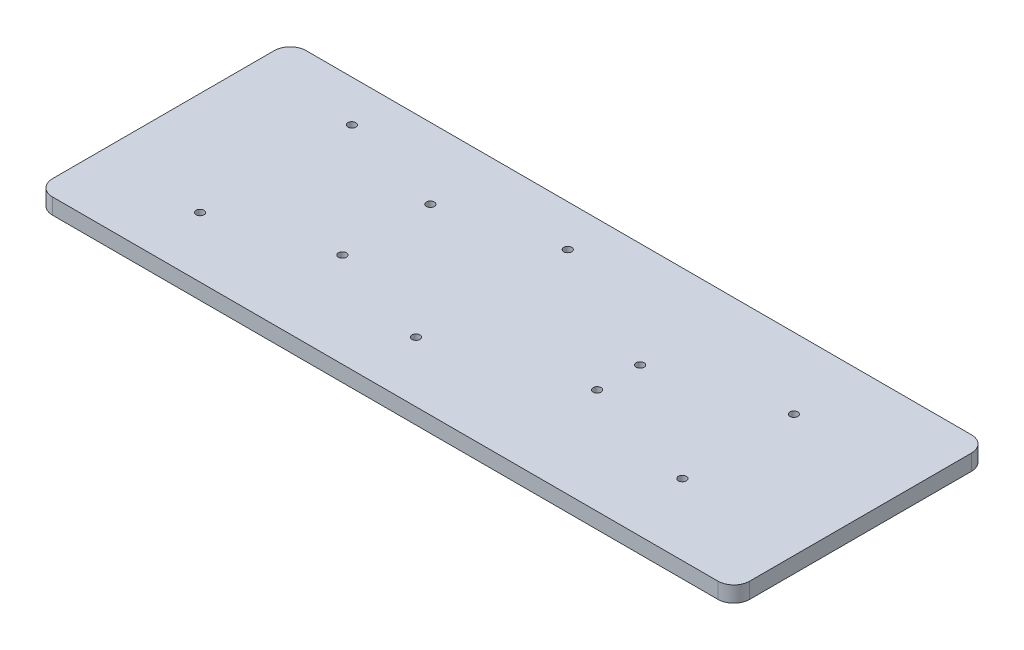
ISO-10303-21;
HEADER;
FILE_DESCRIPTION(('STEP AP214'),'2;1');
FILE_NAME('part.step','',(''),(''),'','','');
FILE_SCHEMA(('AUTOMOTIVE_DESIGN { 1 0 10303 214 1 1 1 1 }'));
ENDSEC;
DATA;
#1=APPLICATION_CONTEXT('core data for automotive mechanical design processes');
#2=APPLICATION_PROTOCOL_DEFINITION('international standard','automotive_design',2000,#1);
#3=PRODUCT_CONTEXT('',#1,'mechanical');
#4=PRODUCT('Part','Part','',(#3));
#5=PRODUCT_RELATED_PRODUCT_CATEGORY('part','',(#4));
#6=PRODUCT_DEFINITION_FORMATION('','',#4);
#7=PRODUCT_DEFINITION_CONTEXT('part definition',#1,'design');
#8=PRODUCT_DEFINITION('design','',#6,#7);
#9=PRODUCT_DEFINITION_SHAPE('','',#8);
#10=(LENGTH_UNIT() NAMED_UNIT(*) SI_UNIT(.MILLI.,.METRE.));
#11=(NAMED_UNIT(*) PLANE_ANGLE_UNIT() SI_UNIT($,.RADIAN.));
#12=(NAMED_UNIT(*) SI_UNIT($,.STERADIAN.) SOLID_ANGLE_UNIT());
#13=UNCERTAINTY_MEASURE_WITH_UNIT(LENGTH_MEASURE(1.E-05),#10,'distance_accuracy_value','');
#14=(GEOMETRIC_REPRESENTATION_CONTEXT(3) GLOBAL_UNCERTAINTY_ASSIGNED_CONTEXT((#13)) GLOBAL_UNIT_ASSIGNED_CONTEXT((#10,
#11,#12)) REPRESENTATION_CONTEXT('',''));
#15=CARTESIAN_POINT('',(0.,0.,0.));
#16=DIRECTION('',(0.,0.,1.));
#17=DIRECTION('',(1.,0.,0.));
#18=AXIS2_PLACEMENT_3D('',#15,#16,#17);
#19=CARTESIAN_POINT('',(911.579762169948,-57.9059737890912,20.8790325673059));
#20=DIRECTION('',(0.,1.,0.));
#21=DIRECTION('',(0.,0.,1.));
#22=AXIS2_PLACEMENT_3D('',#19,#20,#21);
#23=PLANE('',#22);
#24=CARTESIAN_POINT('',(1263.75808829654,-57.9059737890912,105.2220794053));
#25=DIRECTION('',(0.,1.,0.));
#26=DIRECTION('',(0.,0.,1.));
#27=AXIS2_PLACEMENT_3D('',#24,#25,#26);
#28=CIRCLE('',#27,3.17499999999986);
#29=CARTESIAN_POINT('',(1263.75808829654,-57.9059737890912,108.397079405299));
#30=VERTEX_POINT('',#29);
#31=EDGE_CURVE('E497',#30,#30,#28,.T.);
#32=ORIENTED_EDGE('',*,*,#31,.F.);
#33=EDGE_LOOP('',(#32));
#34=FACE_BOUND('',#33,.T.);
#35=CARTESIAN_POINT('',(1263.75808829654,-57.9059737890912,139.735985729313));
#36=DIRECTION('',(0.,1.,0.));
#37=DIRECTION('',(0.,0.,1.));
#38=AXIS2_PLACEMENT_3D('',#35,#36,#37);
#39=CIRCLE('',#38,3.17499999999986);
#40=CARTESIAN_POINT('',(1263.75808829654,-57.9059737890912,142.910985729313));
#41=VERTEX_POINT('',#40);
#42=EDGE_CURVE('E139',#41,#41,#39,.T.);
#43=ORIENTED_EDGE('',*,*,#42,.F.);
#44=EDGE_LOOP('',(#43));
#45=FACE_BOUND('',#44,.T.);
#46=CARTESIAN_POINT('',(1154.58194925451,-57.9059737890912,54.0981721017048));
#47=DIRECTION('',(0.,1.,0.));
#48=DIRECTION('',(0.,0.,1.));
#49=AXIS2_PLACEMENT_3D('',#46,#47,#48);
#50=CIRCLE('',#49,3.175);
#51=CARTESIAN_POINT('',(1154.58194925451,-57.9059737890912,57.2731721017048));
#52=VERTEX_POINT('',#51);
#53=EDGE_CURVE('E43',#52,#52,#50,.F.);
#54=ORIENTED_EDGE('',*,*,#53,.T.);
#55=EDGE_LOOP('',(#54));
#56=FACE_BOUND('',#55,.T.);
#57=CARTESIAN_POINT('',(981.548810971771,-57.9059737890912,54.0981721017048));
#58=DIRECTION('',(0.,1.,0.));
#59=DIRECTION('',(0.,0.,1.));
#60=AXIS2_PLACEMENT_3D('',#57,#58,#59);
#61=CIRCLE('',#60,3.175);
#62=CARTESIAN_POINT('',(981.548810971771,-57.9059737890912,57.2731721017048));
#63=VERTEX_POINT('',#62);
#64=EDGE_CURVE('E217',#63,#63,#61,.F.);
#65=ORIENTED_EDGE('',*,*,#64,.T.);
#66=EDGE_LOOP('',(#65));
#67=FACE_BOUND('',#66,.T.);
#68=CARTESIAN_POINT('',(1068.06538011314,-57.9059737890912,148.226965703462));
#69=DIRECTION('',(0.,1.,0.));
#70=DIRECTION('',(0.,0.,1.));
#71=AXIS2_PLACEMENT_3D('',#68,#69,#70);
#72=CIRCLE('',#71,3.175);
#73=CARTESIAN_POINT('',(1068.06538011314,-57.9059737890912,151.401965703462));
#74=VERTEX_POINT('',#73);
#75=EDGE_CURVE('E210',#74,#74,#72,.F.);
#76=ORIENTED_EDGE('',*,*,#75,.T.);
#77=EDGE_LOOP('',(#76));
#78=FACE_BOUND('',#77,.T.);
#79=CARTESIAN_POINT('',(1154.58194925451,-57.9059737890912,175.771167437158));
#80=DIRECTION('',(0.,1.,0.));
#81=DIRECTION('',(0.,0.,1.));
#82=AXIS2_PLACEMENT_3D('',#79,#80,#81);
#83=CIRCLE('',#82,3.175);
#84=CARTESIAN_POINT('',(1154.58194925451,-57.9059737890912,178.946167437158));
#85=VERTEX_POINT('',#84);
#86=EDGE_CURVE('E207',#85,#85,#83,.F.);
#87=ORIENTED_EDGE('',*,*,#86,.T.);
#88=EDGE_LOOP('',(#87));
#89=FACE_BOUND('',#88,.T.);
#90=CARTESIAN_POINT('',(981.548810971771,-57.9059737890912,175.771167437158));
#91=DIRECTION('',(0.,1.,0.));
#92=DIRECTION('',(0.,0.,1.));
#93=AXIS2_PLACEMENT_3D('',#90,#91,#92);
#94=CIRCLE('',#93,3.175);
#95=CARTESIAN_POINT('',(981.548810971771,-57.9059737890912,178.946167437158));
#96=VERTEX_POINT('',#95);
#97=EDGE_CURVE('E214',#96,#96,#94,.F.);
#98=ORIENTED_EDGE('',*,*,#97,.T.);
#99=EDGE_LOOP('',(#98));
#100=FACE_BOUND('',#99,.T.);
#101=CARTESIAN_POINT('',(1068.06538011314,-57.9059737890912,77.7278467876854));
#102=DIRECTION('',(0.,1.,0.));
#103=DIRECTION('',(0.,0.,1.));
#104=AXIS2_PLACEMENT_3D('',#101,#102,#103);
#105=CIRCLE('',#104,3.175);
#106=CARTESIAN_POINT('',(1068.06538011314,-57.9059737890912,80.9028467876854));
#107=VERTEX_POINT('',#106);
#108=EDGE_CURVE('E137',#107,#107,#105,.F.);
#109=ORIENTED_EDGE('',*,*,#108,.T.);
#110=EDGE_LOOP('',(#109));
#111=FACE_BOUND('',#110,.T.);
#112=DIRECTION('',(-1.,0.,0.));
#113=VECTOR('',#112,1.);
#114=CARTESIAN_POINT('',(898.879762169948,-57.9059737890912,20.8790325673059));
#115=LINE('',#114,#113);
#116=CARTESIAN_POINT('',(1444.97976216995,-57.9059737890912,20.8790325673059));
#117=VERTEX_POINT('',#116);
#118=CARTESIAN_POINT('',(911.579762169948,-57.9059737890912,20.8790325673059));
#119=VERTEX_POINT('',#118);
#120=EDGE_CURVE('E171',#117,#119,#115,.T.);
#121=ORIENTED_EDGE('',*,*,#120,.T.);
#122=CARTESIAN_POINT('',(911.579762169948,-57.9059737890912,33.5790325673059));
#123=DIRECTION('',(0.,-1.,0.));
#124=DIRECTION('',(0.,0.,-1.));
#125=AXIS2_PLACEMENT_3D('',#122,#123,#124);
#126=CIRCLE('',#125,12.7);
#127=CARTESIAN_POINT('',(898.879762169948,-57.9059737890912,33.5790325673059));
#128=VERTEX_POINT('',#127);
#129=EDGE_CURVE('E64',#119,#128,#126,.F.);
#130=ORIENTED_EDGE('',*,*,#129,.T.);
#131=DIRECTION('',(0.,0.,1.));
#132=VECTOR('',#131,1.);
#133=CARTESIAN_POINT('',(898.879762169948,-57.9059737890912,224.079032567306));
#134=LINE('',#133,#132);
#135=CARTESIAN_POINT('',(898.879762169948,-57.9059737890912,211.379032567306));
#136=VERTEX_POINT('',#135);
#137=EDGE_CURVE('E168',#128,#136,#134,.T.);
#138=ORIENTED_EDGE('',*,*,#137,.T.);
#139=CARTESIAN_POINT('',(911.579762169948,-57.9059737890912,211.379032567306));
#140=DIRECTION('',(0.,-1.,0.));
#141=DIRECTION('',(0.,0.,-1.));
#142=AXIS2_PLACEMENT_3D('',#139,#140,#141);
#143=CIRCLE('',#142,12.7);
#144=CARTESIAN_POINT('',(911.579762169948,-57.9059737890912,224.079032567306));
#145=VERTEX_POINT('',#144);
#146=EDGE_CURVE('E156',#136,#145,#143,.F.);
#147=ORIENTED_EDGE('',*,*,#146,.T.);
#148=DIRECTION('',(1.,0.,0.));
#149=VECTOR('',#148,1.);
#150=CARTESIAN_POINT('',(1457.67976216995,-57.9059737890912,224.079032567306));
#151=LINE('',#150,#149);
#152=CARTESIAN_POINT('',(1444.97976216995,-57.9059737890912,224.079032567306));
#153=VERTEX_POINT('',#152);
#154=EDGE_CURVE('E173',#145,#153,#151,.T.);
#155=ORIENTED_EDGE('',*,*,#154,.T.);
#156=CARTESIAN_POINT('',(1444.97976216995,-57.9059737890912,211.379032567306));
#157=DIRECTION('',(0.,-1.,0.));
#158=DIRECTION('',(0.,0.,-1.));
#159=AXIS2_PLACEMENT_3D('',#156,#157,#158);
#160=CIRCLE('',#159,12.7);
#161=CARTESIAN_POINT('',(1457.67976216995,-57.9059737890912,211.379032567306));
#162=VERTEX_POINT('',#161);
#163=EDGE_CURVE('E159',#153,#162,#160,.F.);
#164=ORIENTED_EDGE('',*,*,#163,.T.);
#165=DIRECTION('',(0.,0.,-1.));
#166=VECTOR('',#165,1.);
#167=CARTESIAN_POINT('',(1457.67976216995,-57.9059737890912,175.374532567307));
#168=LINE('',#167,#166);
#169=CARTESIAN_POINT('',(1457.67976216995,-57.9059737890912,33.5790325673059));
#170=VERTEX_POINT('',#169);
#171=EDGE_CURVE('E165',#162,#170,#168,.T.);
#172=ORIENTED_EDGE('',*,*,#171,.T.);
#173=CARTESIAN_POINT('',(1444.97976216995,-57.9059737890912,33.5790325673059));
#174=DIRECTION('',(0.,-1.,0.));
#175=DIRECTION('',(0.,0.,-1.));
#176=AXIS2_PLACEMENT_3D('',#173,#174,#175);
#177=CIRCLE('',#176,12.7);
#178=EDGE_CURVE('E56',#170,#117,#177,.F.);
#179=ORIENTED_EDGE('',*,*,#178,.T.);
#180=EDGE_LOOP('',(#121,#130,#138,#147,#155,#164,#172,#179));
#181=FACE_BOUND('',#180,.T.);
#182=CARTESIAN_POINT('',(1359.51608829654,-57.9059737890912,167.167985729313));
#183=DIRECTION('',(0.,1.,0.));
#184=DIRECTION('',(0.,0.,1.));
#185=AXIS2_PLACEMENT_3D('',#182,#183,#184);
#186=CIRCLE('',#185,3.17499999999997);
#187=CARTESIAN_POINT('',(1359.51608829654,-57.9059737890912,170.342985729313));
#188=VERTEX_POINT('',#187);
#189=EDGE_CURVE('E201',#188,#188,#186,.T.);
#190=ORIENTED_EDGE('',*,*,#189,.F.);
#191=EDGE_LOOP('',(#190));
#192=FACE_BOUND('',#191,.T.);
#193=CARTESIAN_POINT('',(1359.51608829654,-57.9059737890912,77.7900794052995));
#194=DIRECTION('',(0.,1.,0.));
#195=DIRECTION('',(0.,0.,1.));
#196=AXIS2_PLACEMENT_3D('',#193,#194,#195);
#197=CIRCLE('',#196,3.17499999999997);
#198=CARTESIAN_POINT('',(1359.51608829654,-57.9059737890912,80.9650794052995));
#199=VERTEX_POINT('',#198);
#200=EDGE_CURVE('E48',#199,#199,#197,.T.);
#201=ORIENTED_EDGE('',*,*,#200,.F.);
#202=EDGE_LOOP('',(#201));
#203=FACE_BOUND('',#202,.T.);
#204=ADVANCED_FACE('F39',(#34,#45,#56,#67,#78,#89,#100,#111,#181,#192,#203),#23,.T.);
#205=CARTESIAN_POINT('',(898.879762169948,-70.6059737890912,224.079032567306));
#206=DIRECTION('',(-1.,0.,0.));
#207=DIRECTION('',(0.,0.,1.));
#208=AXIS2_PLACEMENT_3D('',#205,#206,#207);
#209=PLANE('',#208);
#210=ORIENTED_EDGE('',*,*,#137,.F.);
#211=DIRECTION('',(0.,1.,0.));
#212=VECTOR('',#211,1.);
#213=CARTESIAN_POINT('',(898.879762169948,-70.6059737890912,33.5790325673059));
#214=LINE('',#213,#212);
#215=CARTESIAN_POINT('',(898.879762169948,-70.6059737890912,33.5790325673059));
#216=VERTEX_POINT('',#215);
#217=EDGE_CURVE('E150',#128,#216,#214,.F.);
#218=ORIENTED_EDGE('',*,*,#217,.T.);
#219=DIRECTION('',(0.,0.,1.));
#220=VECTOR('',#219,1.);
#221=CARTESIAN_POINT('',(898.879762169948,-70.6059737890912,224.079032567306));
#222=LINE('',#221,#220);
#223=CARTESIAN_POINT('',(898.879762169948,-70.6059737890912,211.379032567306));
#224=VERTEX_POINT('',#223);
#225=EDGE_CURVE('E167',#216,#224,#222,.T.);
#226=ORIENTED_EDGE('',*,*,#225,.T.);
#227=DIRECTION('',(0.,1.,0.));
#228=VECTOR('',#227,1.);
#229=CARTESIAN_POINT('',(898.879762169948,-70.6059737890912,211.379032567306));
#230=LINE('',#229,#228);
#231=EDGE_CURVE('E152',#224,#136,#230,.T.);
#232=ORIENTED_EDGE('',*,*,#231,.T.);
#233=EDGE_LOOP('',(#210,#218,#226,#232));
#234=FACE_BOUND('',#233,.T.);
#235=ADVANCED_FACE('F238',(#234),#209,.T.);
#236=CARTESIAN_POINT('',(898.879762169948,-70.6059737890912,20.8790325673059));
#237=DIRECTION('',(0.,0.,-1.));
#238=DIRECTION('',(-1.,0.,0.));
#239=AXIS2_PLACEMENT_3D('',#236,#237,#238);
#240=PLANE('',#239);
#241=DIRECTION('',(-1.,0.,0.));
#242=VECTOR('',#241,1.);
#243=CARTESIAN_POINT('',(898.879762169948,-70.6059737890912,20.8790325673059));
#244=LINE('',#243,#242);
#245=CARTESIAN_POINT('',(1444.97976216995,-70.6059737890912,20.8790325673059));
#246=VERTEX_POINT('',#245);
#247=CARTESIAN_POINT('',(911.579762169948,-70.6059737890912,20.8790325673059));
#248=VERTEX_POINT('',#247);
#249=EDGE_CURVE('E116',#246,#248,#244,.T.);
#250=ORIENTED_EDGE('',*,*,#249,.T.);
#251=DIRECTION('',(0.,1.,0.));
#252=VECTOR('',#251,1.);
#253=CARTESIAN_POINT('',(911.579762169948,-70.6059737890912,20.8790325673059));
#254=LINE('',#253,#252);
#255=EDGE_CURVE('E161',#248,#119,#254,.T.);
#256=ORIENTED_EDGE('',*,*,#255,.T.);
#257=ORIENTED_EDGE('',*,*,#120,.F.);
#258=DIRECTION('',(0.,1.,0.));
#259=VECTOR('',#258,1.);
#260=CARTESIAN_POINT('',(1444.97976216995,-70.6059737890912,20.8790325673059));
#261=LINE('',#260,#259);
#262=EDGE_CURVE('E163',#117,#246,#261,.F.);
#263=ORIENTED_EDGE('',*,*,#262,.T.);
#264=EDGE_LOOP('',(#250,#256,#257,#263));
#265=FACE_BOUND('',#264,.T.);
#266=ADVANCED_FACE('F240',(#265),#240,.T.);
#267=CARTESIAN_POINT('',(1457.67976216995,-70.6059737890912,224.079032567306));
#268=DIRECTION('',(0.,0.,1.));
#269=DIRECTION('',(1.,0.,0.));
#270=AXIS2_PLACEMENT_3D('',#267,#268,#269);
#271=PLANE('',#270);
#272=ORIENTED_EDGE('',*,*,#154,.F.);
#273=DIRECTION('',(0.,1.,0.));
#274=VECTOR('',#273,1.);
#275=CARTESIAN_POINT('',(911.579762169948,-70.6059737890912,224.079032567306));
#276=LINE('',#275,#274);
#277=CARTESIAN_POINT('',(911.579762169948,-70.6059737890912,224.079032567306));
#278=VERTEX_POINT('',#277);
#279=EDGE_CURVE('E134',#145,#278,#276,.F.);
#280=ORIENTED_EDGE('',*,*,#279,.T.);
#281=DIRECTION('',(1.,0.,0.));
#282=VECTOR('',#281,1.);
#283=CARTESIAN_POINT('',(1457.67976216995,-70.6059737890912,224.079032567306));
#284=LINE('',#283,#282);
#285=CARTESIAN_POINT('',(1444.97976216995,-70.6059737890912,224.079032567306));
#286=VERTEX_POINT('',#285);
#287=EDGE_CURVE('E130',#278,#286,#284,.T.);
#288=ORIENTED_EDGE('',*,*,#287,.T.);
#289=DIRECTION('',(0.,1.,0.));
#290=VECTOR('',#289,1.);
#291=CARTESIAN_POINT('',(1444.97976216995,-70.6059737890912,224.079032567306));
#292=LINE('',#291,#290);
#293=EDGE_CURVE('E143',#286,#153,#292,.T.);
#294=ORIENTED_EDGE('',*,*,#293,.T.);
#295=EDGE_LOOP('',(#272,#280,#288,#294));
#296=FACE_BOUND('',#295,.T.);
#297=ADVANCED_FACE('F246',(#296),#271,.T.);
#298=CARTESIAN_POINT('',(1457.67976216995,-213.112612249011,31.1034974157241));
#299=DIRECTION('',(1.,0.,0.));
#300=DIRECTION('',(0.,0.,-1.));
#301=AXIS2_PLACEMENT_3D('',#298,#299,#300);
#302=PLANE('',#301);
#303=DIRECTION('',(0.,0.,-1.));
#304=VECTOR('',#303,1.);
#305=CARTESIAN_POINT('',(1457.67976216995,-70.6059737890912,20.8790325673059));
#306=LINE('',#305,#304);
#307=CARTESIAN_POINT('',(1457.67976216995,-70.6059737890912,211.379032567306));
#308=VERTEX_POINT('',#307);
#309=CARTESIAN_POINT('',(1457.67976216995,-70.6059737890912,33.5790325673059));
#310=VERTEX_POINT('',#309);
#311=EDGE_CURVE('E113',#308,#310,#306,.T.);
#312=ORIENTED_EDGE('',*,*,#311,.T.);
#313=DIRECTION('',(0.,1.,0.));
#314=VECTOR('',#313,1.);
#315=CARTESIAN_POINT('',(1457.67976216995,-213.112612249011,33.5790325673059));
#316=LINE('',#315,#314);
#317=EDGE_CURVE('E127',#310,#170,#316,.T.);
#318=ORIENTED_EDGE('',*,*,#317,.T.);
#319=ORIENTED_EDGE('',*,*,#171,.F.);
#320=DIRECTION('',(0.,1.,0.));
#321=VECTOR('',#320,1.);
#322=CARTESIAN_POINT('',(1457.67976216995,-213.112612249011,211.379032567306));
#323=LINE('',#322,#321);
#324=EDGE_CURVE('E129',#162,#308,#323,.F.);
#325=ORIENTED_EDGE('',*,*,#324,.T.);
#326=EDGE_LOOP('',(#312,#318,#319,#325));
#327=FACE_BOUND('',#326,.T.);
#328=ADVANCED_FACE('F125',(#327),#302,.T.);
#329=CARTESIAN_POINT('',(1087.08581097177,-70.6059737890912,183.503497415724));
#330=DIRECTION('',(0.,-1.,0.));
#331=DIRECTION('',(0.,0.,-1.));
#332=AXIS2_PLACEMENT_3D('',#329,#330,#331);
#333=PLANE('',#332);
#334=CARTESIAN_POINT('',(1263.75808829654,-70.6059737890912,105.2220794053));
#335=DIRECTION('',(0.,-1.,0.));
#336=DIRECTION('',(0.,0.,-1.));
#337=AXIS2_PLACEMENT_3D('',#334,#335,#336);
#338=CIRCLE('',#337,3.17499999999986);
#339=CARTESIAN_POINT('',(1263.75808829654,-70.6059737890912,102.0470794053));
#340=VERTEX_POINT('',#339);
#341=EDGE_CURVE('E211',#340,#340,#338,.F.);
#342=ORIENTED_EDGE('',*,*,#341,.T.);
#343=EDGE_LOOP('',(#342));
#344=FACE_BOUND('',#343,.T.);
#345=CARTESIAN_POINT('',(1263.75808829654,-70.6059737890912,139.735985729313));
#346=DIRECTION('',(0.,-1.,0.));
#347=DIRECTION('',(0.,0.,-1.));
#348=AXIS2_PLACEMENT_3D('',#345,#346,#347);
#349=CIRCLE('',#348,3.17499999999986);
#350=CARTESIAN_POINT('',(1263.75808829654,-70.6059737890912,136.560985729313));
#351=VERTEX_POINT('',#350);
#352=EDGE_CURVE('E502',#351,#351,#349,.F.);
#353=ORIENTED_EDGE('',*,*,#352,.T.);
#354=EDGE_LOOP('',(#353));
#355=FACE_BOUND('',#354,.T.);
#356=CARTESIAN_POINT('',(1359.51608829654,-70.6059737890912,167.167985729313));
#357=DIRECTION('',(0.,-1.,0.));
#358=DIRECTION('',(0.,0.,-1.));
#359=AXIS2_PLACEMENT_3D('',#356,#357,#358);
#360=CIRCLE('',#359,3.17499999999997);
#361=CARTESIAN_POINT('',(1359.51608829654,-70.6059737890912,163.992985729313));
#362=VERTEX_POINT('',#361);
#363=EDGE_CURVE('E188',#362,#362,#360,.F.);
#364=ORIENTED_EDGE('',*,*,#363,.T.);
#365=EDGE_LOOP('',(#364));
#366=FACE_BOUND('',#365,.T.);
#367=CARTESIAN_POINT('',(1359.51608829654,-70.6059737890912,77.7900794052995));
#368=DIRECTION('',(0.,-1.,0.));
#369=DIRECTION('',(0.,0.,-1.));
#370=AXIS2_PLACEMENT_3D('',#367,#368,#369);
#371=CIRCLE('',#370,3.17499999999997);
#372=CARTESIAN_POINT('',(1359.51608829654,-70.6059737890912,74.6150794052995));
#373=VERTEX_POINT('',#372);
#374=EDGE_CURVE('E11',#373,#373,#371,.F.);
#375=ORIENTED_EDGE('',*,*,#374,.T.);
#376=EDGE_LOOP('',(#375));
#377=FACE_BOUND('',#376,.T.);
#378=CARTESIAN_POINT('',(981.548810971771,-70.6059737890912,54.0981721017048));
#379=DIRECTION('',(0.,-1.,0.));
#380=DIRECTION('',(0.,0.,-1.));
#381=AXIS2_PLACEMENT_3D('',#378,#379,#380);
#382=CIRCLE('',#381,3.175);
#383=CARTESIAN_POINT('',(981.548810971771,-70.6059737890912,50.9231721017048));
#384=VERTEX_POINT('',#383);
#385=EDGE_CURVE('E185',#384,#384,#382,.F.);
#386=ORIENTED_EDGE('',*,*,#385,.T.);
#387=EDGE_LOOP('',(#386));
#388=FACE_BOUND('',#387,.T.);
#389=CARTESIAN_POINT('',(1068.06538011314,-70.6059737890912,77.7278467876854));
#390=DIRECTION('',(0.,-1.,0.));
#391=DIRECTION('',(0.,0.,-1.));
#392=AXIS2_PLACEMENT_3D('',#389,#390,#391);
#393=CIRCLE('',#392,3.175);
#394=CARTESIAN_POINT('',(1068.06538011314,-70.6059737890912,74.5528467876854));
#395=VERTEX_POINT('',#394);
#396=EDGE_CURVE('E189',#395,#395,#393,.F.);
#397=ORIENTED_EDGE('',*,*,#396,.T.);
#398=EDGE_LOOP('',(#397));
#399=FACE_BOUND('',#398,.T.);
#400=CARTESIAN_POINT('',(1154.58194925451,-70.6059737890912,54.0981721017048));
#401=DIRECTION('',(0.,-1.,0.));
#402=DIRECTION('',(0.,0.,-1.));
#403=AXIS2_PLACEMENT_3D('',#400,#401,#402);
#404=CIRCLE('',#403,3.175);
#405=CARTESIAN_POINT('',(1154.58194925451,-70.6059737890912,50.9231721017048));
#406=VERTEX_POINT('',#405);
#407=EDGE_CURVE('E192',#406,#406,#404,.F.);
#408=ORIENTED_EDGE('',*,*,#407,.T.);
#409=EDGE_LOOP('',(#408));
#410=FACE_BOUND('',#409,.T.);
#411=CARTESIAN_POINT('',(1154.58194925451,-70.6059737890912,175.771167437158));
#412=DIRECTION('',(0.,-1.,0.));
#413=DIRECTION('',(0.,0.,-1.));
#414=AXIS2_PLACEMENT_3D('',#411,#412,#413);
#415=CIRCLE('',#414,3.175);
#416=CARTESIAN_POINT('',(1154.58194925451,-70.6059737890912,172.596167437158));
#417=VERTEX_POINT('',#416);
#418=EDGE_CURVE('E195',#417,#417,#415,.F.);
#419=ORIENTED_EDGE('',*,*,#418,.T.);
#420=EDGE_LOOP('',(#419));
#421=FACE_BOUND('',#420,.T.);
#422=CARTESIAN_POINT('',(1068.06538011314,-70.6059737890912,148.226965703462));
#423=DIRECTION('',(0.,-1.,0.));
#424=DIRECTION('',(0.,0.,-1.));
#425=AXIS2_PLACEMENT_3D('',#422,#423,#424);
#426=CIRCLE('',#425,3.175);
#427=CARTESIAN_POINT('',(1068.06538011314,-70.6059737890912,145.051965703462));
#428=VERTEX_POINT('',#427);
#429=EDGE_CURVE('E184',#428,#428,#426,.F.);
#430=ORIENTED_EDGE('',*,*,#429,.T.);
#431=EDGE_LOOP('',(#430));
#432=FACE_BOUND('',#431,.T.);
#433=CARTESIAN_POINT('',(981.548810971771,-70.6059737890912,175.771167437158));
#434=DIRECTION('',(0.,-1.,0.));
#435=DIRECTION('',(0.,0.,-1.));
#436=AXIS2_PLACEMENT_3D('',#433,#434,#435);
#437=CIRCLE('',#436,3.175);
#438=CARTESIAN_POINT('',(981.548810971771,-70.6059737890912,172.596167437158));
#439=VERTEX_POINT('',#438);
#440=EDGE_CURVE('E176',#439,#439,#437,.F.);
#441=ORIENTED_EDGE('',*,*,#440,.T.);
#442=EDGE_LOOP('',(#441));
#443=FACE_BOUND('',#442,.T.);
#444=ORIENTED_EDGE('',*,*,#225,.F.);
#445=CARTESIAN_POINT('',(911.579762169948,-70.6059737890912,33.5790325673059));
#446=DIRECTION('',(0.,-1.,0.));
#447=DIRECTION('',(0.,0.,-1.));
#448=AXIS2_PLACEMENT_3D('',#445,#446,#447);
#449=CIRCLE('',#448,12.7);
#450=EDGE_CURVE('E146',#216,#248,#449,.T.);
#451=ORIENTED_EDGE('',*,*,#450,.T.);
#452=ORIENTED_EDGE('',*,*,#249,.F.);
#453=CARTESIAN_POINT('',(1444.97976216995,-70.6059737890912,33.5790325673059));
#454=DIRECTION('',(0.,-1.,0.));
#455=DIRECTION('',(0.,0.,-1.));
#456=AXIS2_PLACEMENT_3D('',#453,#454,#455);
#457=CIRCLE('',#456,12.7);
#458=EDGE_CURVE('E109',#246,#310,#457,.T.);
#459=ORIENTED_EDGE('',*,*,#458,.T.);
#460=ORIENTED_EDGE('',*,*,#311,.F.);
#461=CARTESIAN_POINT('',(1444.97976216995,-70.6059737890912,211.379032567306));
#462=DIRECTION('',(0.,-1.,0.));
#463=DIRECTION('',(0.,0.,-1.));
#464=AXIS2_PLACEMENT_3D('',#461,#462,#463);
#465=CIRCLE('',#464,12.7);
#466=EDGE_CURVE('E120',#308,#286,#465,.T.);
#467=ORIENTED_EDGE('',*,*,#466,.T.);
#468=ORIENTED_EDGE('',*,*,#287,.F.);
#469=CARTESIAN_POINT('',(911.579762169948,-70.6059737890912,211.379032567306));
#470=DIRECTION('',(0.,-1.,0.));
#471=DIRECTION('',(0.,0.,-1.));
#472=AXIS2_PLACEMENT_3D('',#469,#470,#471);
#473=CIRCLE('',#472,12.7);
#474=EDGE_CURVE('E121',#278,#224,#473,.T.);
#475=ORIENTED_EDGE('',*,*,#474,.T.);
#476=EDGE_LOOP('',(#444,#451,#452,#459,#460,#467,#468,#475));
#477=FACE_BOUND('',#476,.T.);
#478=ADVANCED_FACE('F112',(#344,#355,#366,#377,#388,#399,#410,#421,#432,#443,#477),#333,.T.);
#479=CARTESIAN_POINT('',(1359.51608829654,-79.5862299101603,167.167985729313));
#480=DIRECTION('',(0.,1.,0.));
#481=DIRECTION('',(0.,0.,1.));
#482=AXIS2_PLACEMENT_3D('',#479,#480,#481);
#483=CYLINDRICAL_SURFACE('',#482,3.17499999999997);
#484=ORIENTED_EDGE('',*,*,#189,.T.);
#485=EDGE_LOOP('',(#484));
#486=FACE_BOUND('',#485,.T.);
#487=ORIENTED_EDGE('',*,*,#363,.F.);
#488=EDGE_LOOP('',(#487));
#489=FACE_BOUND('',#488,.T.);
#490=ADVANCED_FACE('F257',(#486,#489),#483,.F.);
#491=CARTESIAN_POINT('',(1359.51608829654,-79.5862299101603,77.7900794052995));
#492=DIRECTION('',(0.,1.,0.));
#493=DIRECTION('',(0.,0.,1.));
#494=AXIS2_PLACEMENT_3D('',#491,#492,#493);
#495=CYLINDRICAL_SURFACE('',#494,3.17499999999997);
#496=ORIENTED_EDGE('',*,*,#200,.T.);
#497=EDGE_LOOP('',(#496));
#498=FACE_BOUND('',#497,.T.);
#499=ORIENTED_EDGE('',*,*,#374,.F.);
#500=EDGE_LOOP('',(#499));
#501=FACE_BOUND('',#500,.T.);
#502=ADVANCED_FACE('F259',(#498,#501),#495,.F.);
#503=CARTESIAN_POINT('',(1444.97976216995,-70.6059737890912,211.379032567306));
#504=DIRECTION('',(0.,1.,0.));
#505=DIRECTION('',(0.,0.,1.));
#506=AXIS2_PLACEMENT_3D('',#503,#504,#505);
#507=CYLINDRICAL_SURFACE('',#506,12.7);
#508=ORIENTED_EDGE('',*,*,#466,.F.);
#509=ORIENTED_EDGE('',*,*,#324,.F.);
#510=ORIENTED_EDGE('',*,*,#163,.F.);
#511=ORIENTED_EDGE('',*,*,#293,.F.);
#512=EDGE_LOOP('',(#508,#509,#510,#511));
#513=FACE_BOUND('',#512,.T.);
#514=ADVANCED_FACE('F262',(#513),#507,.T.);
#515=CARTESIAN_POINT('',(1444.97976216995,-213.112612249011,33.5790325673059));
#516=DIRECTION('',(0.,1.,0.));
#517=DIRECTION('',(0.,0.,1.));
#518=AXIS2_PLACEMENT_3D('',#515,#516,#517);
#519=CYLINDRICAL_SURFACE('',#518,12.7);
#520=ORIENTED_EDGE('',*,*,#458,.F.);
#521=ORIENTED_EDGE('',*,*,#262,.F.);
#522=ORIENTED_EDGE('',*,*,#178,.F.);
#523=ORIENTED_EDGE('',*,*,#317,.F.);
#524=EDGE_LOOP('',(#520,#521,#522,#523));
#525=FACE_BOUND('',#524,.T.);
#526=ADVANCED_FACE('F132',(#525),#519,.T.);
#527=CARTESIAN_POINT('',(911.579762169948,-70.6059737890912,211.379032567306));
#528=DIRECTION('',(0.,1.,0.));
#529=DIRECTION('',(0.,0.,1.));
#530=AXIS2_PLACEMENT_3D('',#527,#528,#529);
#531=CYLINDRICAL_SURFACE('',#530,12.7);
#532=ORIENTED_EDGE('',*,*,#474,.F.);
#533=ORIENTED_EDGE('',*,*,#279,.F.);
#534=ORIENTED_EDGE('',*,*,#146,.F.);
#535=ORIENTED_EDGE('',*,*,#231,.F.);
#536=EDGE_LOOP('',(#532,#533,#534,#535));
#537=FACE_BOUND('',#536,.T.);
#538=ADVANCED_FACE('F348',(#537),#531,.T.);
#539=CARTESIAN_POINT('',(911.579762169948,-70.6059737890912,33.5790325673059));
#540=DIRECTION('',(0.,1.,0.));
#541=DIRECTION('',(0.,0.,1.));
#542=AXIS2_PLACEMENT_3D('',#539,#540,#541);
#543=CYLINDRICAL_SURFACE('',#542,12.7);
#544=ORIENTED_EDGE('',*,*,#450,.F.);
#545=ORIENTED_EDGE('',*,*,#217,.F.);
#546=ORIENTED_EDGE('',*,*,#129,.F.);
#547=ORIENTED_EDGE('',*,*,#255,.F.);
#548=EDGE_LOOP('',(#544,#545,#546,#547));
#549=FACE_BOUND('',#548,.T.);
#550=ADVANCED_FACE('F273',(#549),#543,.T.);
#551=CARTESIAN_POINT('',(1154.58194925451,-79.5862299101603,175.771167437158));
#552=DIRECTION('',(0.,1.,0.));
#553=DIRECTION('',(0.,0.,1.));
#554=AXIS2_PLACEMENT_3D('',#551,#552,#553);
#555=CYLINDRICAL_SURFACE('',#554,3.175);
#556=ORIENTED_EDGE('',*,*,#418,.F.);
#557=EDGE_LOOP('',(#556));
#558=FACE_BOUND('',#557,.T.);
#559=ORIENTED_EDGE('',*,*,#86,.F.);
#560=EDGE_LOOP('',(#559));
#561=FACE_BOUND('',#560,.T.);
#562=ADVANCED_FACE('F271',(#558,#561),#555,.F.);
#563=CARTESIAN_POINT('',(1068.06538011314,-79.5862299101603,148.226965703462));
#564=DIRECTION('',(0.,1.,0.));
#565=DIRECTION('',(0.,0.,1.));
#566=AXIS2_PLACEMENT_3D('',#563,#564,#565);
#567=CYLINDRICAL_SURFACE('',#566,3.175);
#568=ORIENTED_EDGE('',*,*,#429,.F.);
#569=EDGE_LOOP('',(#568));
#570=FACE_BOUND('',#569,.T.);
#571=ORIENTED_EDGE('',*,*,#75,.F.);
#572=EDGE_LOOP('',(#571));
#573=FACE_BOUND('',#572,.T.);
#574=ADVANCED_FACE('F269',(#570,#573),#567,.F.);
#575=CARTESIAN_POINT('',(981.548810971771,-79.5862299101603,175.771167437158));
#576=DIRECTION('',(0.,1.,0.));
#577=DIRECTION('',(0.,0.,1.));
#578=AXIS2_PLACEMENT_3D('',#575,#576,#577);
#579=CYLINDRICAL_SURFACE('',#578,3.175);
#580=ORIENTED_EDGE('',*,*,#440,.F.);
#581=EDGE_LOOP('',(#580));
#582=FACE_BOUND('',#581,.T.);
#583=ORIENTED_EDGE('',*,*,#97,.F.);
#584=EDGE_LOOP('',(#583));
#585=FACE_BOUND('',#584,.T.);
#586=ADVANCED_FACE('F234',(#582,#585),#579,.F.);
#587=CARTESIAN_POINT('',(981.548810971771,-79.5862299101603,54.0981721017048));
#588=DIRECTION('',(0.,1.,0.));
#589=DIRECTION('',(0.,0.,1.));
#590=AXIS2_PLACEMENT_3D('',#587,#588,#589);
#591=CYLINDRICAL_SURFACE('',#590,3.175);
#592=ORIENTED_EDGE('',*,*,#385,.F.);
#593=EDGE_LOOP('',(#592));
#594=FACE_BOUND('',#593,.T.);
#595=ORIENTED_EDGE('',*,*,#64,.F.);
#596=EDGE_LOOP('',(#595));
#597=FACE_BOUND('',#596,.T.);
#598=ADVANCED_FACE('F225',(#594,#597),#591,.F.);
#599=CARTESIAN_POINT('',(1068.06538011314,-79.5862299101603,77.7278467876854));
#600=DIRECTION('',(0.,1.,0.));
#601=DIRECTION('',(0.,0.,1.));
#602=AXIS2_PLACEMENT_3D('',#599,#600,#601);
#603=CYLINDRICAL_SURFACE('',#602,3.175);
#604=ORIENTED_EDGE('',*,*,#396,.F.);
#605=EDGE_LOOP('',(#604));
#606=FACE_BOUND('',#605,.T.);
#607=ORIENTED_EDGE('',*,*,#108,.F.);
#608=EDGE_LOOP('',(#607));
#609=FACE_BOUND('',#608,.T.);
#610=ADVANCED_FACE('F223',(#606,#609),#603,.F.);
#611=CARTESIAN_POINT('',(1154.58194925451,-79.5862299101603,54.0981721017048));
#612=DIRECTION('',(0.,1.,0.));
#613=DIRECTION('',(0.,0.,1.));
#614=AXIS2_PLACEMENT_3D('',#611,#612,#613);
#615=CYLINDRICAL_SURFACE('',#614,3.175);
#616=ORIENTED_EDGE('',*,*,#407,.F.);
#617=EDGE_LOOP('',(#616));
#618=FACE_BOUND('',#617,.T.);
#619=ORIENTED_EDGE('',*,*,#53,.F.);
#620=EDGE_LOOP('',(#619));
#621=FACE_BOUND('',#620,.T.);
#622=ADVANCED_FACE('F41',(#618,#621),#615,.F.);
#623=CARTESIAN_POINT('',(1263.75808829654,-79.58622991016,139.735985729313));
#624=DIRECTION('',(0.,1.,0.));
#625=DIRECTION('',(0.,0.,1.));
#626=AXIS2_PLACEMENT_3D('',#623,#624,#625);
#627=CYLINDRICAL_SURFACE('',#626,3.17499999999986);
#628=ORIENTED_EDGE('',*,*,#42,.T.);
#629=EDGE_LOOP('',(#628));
#630=FACE_BOUND('',#629,.T.);
#631=ORIENTED_EDGE('',*,*,#352,.F.);
#632=EDGE_LOOP('',(#631));
#633=FACE_BOUND('',#632,.T.);
#634=ADVANCED_FACE('F232',(#630,#633),#627,.F.);
#635=CARTESIAN_POINT('',(1263.75808829654,-79.58622991016,105.2220794053));
#636=DIRECTION('',(0.,1.,0.));
#637=DIRECTION('',(0.,0.,1.));
#638=AXIS2_PLACEMENT_3D('',#635,#636,#637);
#639=CYLINDRICAL_SURFACE('',#638,3.17499999999986);
#640=ORIENTED_EDGE('',*,*,#31,.T.);
#641=EDGE_LOOP('',(#640));
#642=FACE_BOUND('',#641,.T.);
#643=ORIENTED_EDGE('',*,*,#341,.F.);
#644=EDGE_LOOP('',(#643));
#645=FACE_BOUND('',#644,.T.);
#646=ADVANCED_FACE('F326',(#642,#645),#639,.F.);
#647=CLOSED_SHELL('',(#204,#235,#266,#297,#328,#478,#490,#502,#514,#526,#538,#550,#562,#574,
#586,#598,#610,#622,#634,#646));
#648=MANIFOLD_SOLID_BREP('B2',#647);
#649=ADVANCED_BREP_SHAPE_REPRESENTATION('',(#18,#648),#14);
#650=SHAPE_DEFINITION_REPRESENTATION(#9,#649);
ENDSEC;
END-ISO-10303-21;
